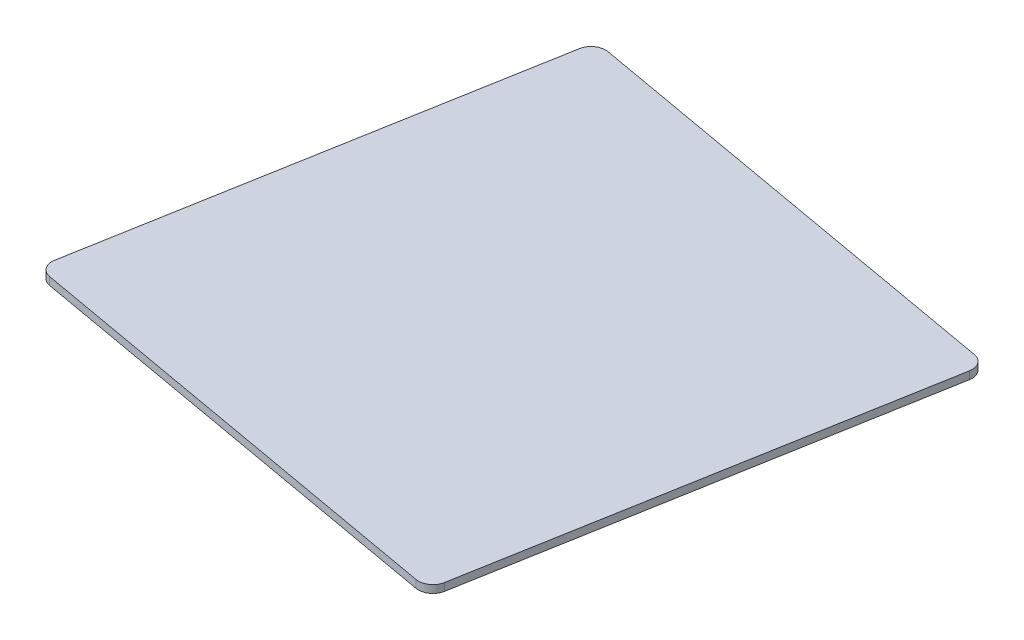
ISO-10303-21;
HEADER;
FILE_DESCRIPTION(('STEP AP214'),'2;1');
FILE_NAME('part.step','',(''),(''),'','','');
FILE_SCHEMA(('AUTOMOTIVE_DESIGN { 1 0 10303 214 1 1 1 1 }'));
ENDSEC;
DATA;
#1=APPLICATION_CONTEXT('core data for automotive mechanical design processes');
#2=APPLICATION_PROTOCOL_DEFINITION('international standard','automotive_design',2000,#1);
#3=PRODUCT_CONTEXT('',#1,'mechanical');
#4=PRODUCT('Part','Part','',(#3));
#5=PRODUCT_RELATED_PRODUCT_CATEGORY('part','',(#4));
#6=PRODUCT_DEFINITION_FORMATION('','',#4);
#7=PRODUCT_DEFINITION_CONTEXT('part definition',#1,'design');
#8=PRODUCT_DEFINITION('design','',#6,#7);
#9=PRODUCT_DEFINITION_SHAPE('','',#8);
#10=(LENGTH_UNIT() NAMED_UNIT(*) SI_UNIT(.MILLI.,.METRE.));
#11=(NAMED_UNIT(*) PLANE_ANGLE_UNIT() SI_UNIT($,.RADIAN.));
#12=(NAMED_UNIT(*) SI_UNIT($,.STERADIAN.) SOLID_ANGLE_UNIT());
#13=UNCERTAINTY_MEASURE_WITH_UNIT(LENGTH_MEASURE(1.E-05),#10,'distance_accuracy_value','');
#14=(GEOMETRIC_REPRESENTATION_CONTEXT(3) GLOBAL_UNCERTAINTY_ASSIGNED_CONTEXT((#13)) GLOBAL_UNIT_ASSIGNED_CONTEXT((#10,
#11,#12)) REPRESENTATION_CONTEXT('',''));
#15=CARTESIAN_POINT('',(0.,0.,0.));
#16=DIRECTION('',(0.,0.,1.));
#17=DIRECTION('',(1.,0.,0.));
#18=AXIS2_PLACEMENT_3D('',#15,#16,#17);
#19=CARTESIAN_POINT('',(-351.034472922423,-29.3713303337753,195.843976174293));
#20=DIRECTION('',(0.,1.,0.));
#21=DIRECTION('',(0.,0.,1.));
#22=AXIS2_PLACEMENT_3D('',#19,#20,#21);
#23=CYLINDRICAL_SURFACE('',#22,3.);
#24=CARTESIAN_POINT('',(-351.034472922423,-27.7713303337753,195.843976174293));
#25=DIRECTION('',(0.,-1.,0.));
#26=DIRECTION('',(0.,0.,-1.));
#27=AXIS2_PLACEMENT_3D('',#24,#25,#26);
#28=CIRCLE('',#27,3.);
#29=CARTESIAN_POINT('',(-353.98826081032,-27.7713303337753,195.319441034084));
#30=VERTEX_POINT('',#29);
#31=CARTESIAN_POINT('',(-350.509937782214,-27.7713303337753,192.890188286397));
#32=VERTEX_POINT('',#31);
#33=EDGE_CURVE('E139',#30,#32,#28,.T.);
#34=ORIENTED_EDGE('',*,*,#33,.T.);
#35=DIRECTION('',(0.,1.,0.));
#36=VECTOR('',#35,1.);
#37=CARTESIAN_POINT('',(-350.509937782214,-29.3713303337753,192.890188286397));
#38=LINE('',#37,#36);
#39=CARTESIAN_POINT('',(-350.509937782214,-29.3713303337753,192.890188286397));
#40=VERTEX_POINT('',#39);
#41=EDGE_CURVE('E11',#40,#32,#38,.T.);
#42=ORIENTED_EDGE('',*,*,#41,.F.);
#43=CARTESIAN_POINT('',(-351.034472922423,-29.3713303337753,195.843976174293));
#44=DIRECTION('',(0.,-1.,0.));
#45=DIRECTION('',(0.,0.,-1.));
#46=AXIS2_PLACEMENT_3D('',#43,#44,#45);
#47=CIRCLE('',#46,3.);
#48=CARTESIAN_POINT('',(-353.98826081032,-29.3713303337753,195.319441034084));
#49=VERTEX_POINT('',#48);
#50=EDGE_CURVE('E156',#49,#40,#47,.T.);
#51=ORIENTED_EDGE('',*,*,#50,.F.);
#52=DIRECTION('',(0.,1.,0.));
#53=VECTOR('',#52,1.);
#54=CARTESIAN_POINT('',(-353.98826081032,-29.3713303337753,195.319441034084));
#55=LINE('',#54,#53);
#56=EDGE_CURVE('E135',#49,#30,#55,.T.);
#57=ORIENTED_EDGE('',*,*,#56,.T.);
#58=EDGE_LOOP('',(#34,#42,#51,#57));
#59=FACE_BOUND('',#58,.T.);
#60=ADVANCED_FACE('F39',(#59),#23,.T.);
#61=CARTESIAN_POINT('',(-350.509937782214,-29.3713303337753,192.890188286397));
#62=DIRECTION('',(-0.174845046736448,0.,0.984595962632251));
#63=DIRECTION('',(0.984595962632251,0.,0.174845046736448));
#64=AXIS2_PLACEMENT_3D('',#61,#62,#63);
#65=PLANE('',#64);
#66=DIRECTION('',(0.984595962632251,0.,0.174845046736448));
#67=VECTOR('',#66,1.);
#68=CARTESIAN_POINT('',(-350.509937782214,-27.7713303337753,192.890188286397));
#69=LINE('',#68,#67);
#70=CARTESIAN_POINT('',(-257.957917294782,-27.7713303337753,209.325622679623));
#71=VERTEX_POINT('',#70);
#72=EDGE_CURVE('E142',#32,#71,#69,.T.);
#73=ORIENTED_EDGE('',*,*,#72,.T.);
#74=DIRECTION('',(0.,1.,0.));
#75=VECTOR('',#74,1.);
#76=CARTESIAN_POINT('',(-257.957917294782,-29.3713303337753,209.325622679623));
#77=LINE('',#76,#75);
#78=CARTESIAN_POINT('',(-257.957917294782,-29.3713303337753,209.325622679623));
#79=VERTEX_POINT('',#78);
#80=EDGE_CURVE('E47',#79,#71,#77,.T.);
#81=ORIENTED_EDGE('',*,*,#80,.F.);
#82=DIRECTION('',(0.984595962632251,0.,0.174845046736448));
#83=VECTOR('',#82,1.);
#84=CARTESIAN_POINT('',(-350.509937782214,-29.3713303337753,192.890188286397));
#85=LINE('',#84,#83);
#86=EDGE_CURVE('E100',#40,#79,#85,.T.);
#87=ORIENTED_EDGE('',*,*,#86,.F.);
#88=ORIENTED_EDGE('',*,*,#41,.T.);
#89=EDGE_LOOP('',(#73,#81,#87,#88));
#90=FACE_BOUND('',#89,.T.);
#91=ADVANCED_FACE('F196',(#90),#65,.F.);
#92=CARTESIAN_POINT('',(-258.482452434992,-29.3713303337753,212.27941056752));
#93=DIRECTION('',(0.,1.,0.));
#94=DIRECTION('',(0.,0.,1.));
#95=AXIS2_PLACEMENT_3D('',#92,#93,#94);
#96=CYLINDRICAL_SURFACE('',#95,3.);
#97=CARTESIAN_POINT('',(-258.482452434992,-27.7713303337753,212.27941056752));
#98=DIRECTION('',(0.,-1.,0.));
#99=DIRECTION('',(0.,0.,-1.));
#100=AXIS2_PLACEMENT_3D('',#97,#98,#99);
#101=CIRCLE('',#100,3.);
#102=CARTESIAN_POINT('',(-255.528664547095,-27.7713303337753,212.803945707729));
#103=VERTEX_POINT('',#102);
#104=EDGE_CURVE('E145',#71,#103,#101,.T.);
#105=ORIENTED_EDGE('',*,*,#104,.T.);
#106=DIRECTION('',(0.,1.,0.));
#107=VECTOR('',#106,1.);
#108=CARTESIAN_POINT('',(-255.528664547095,-29.3713303337753,212.803945707729));
#109=LINE('',#108,#107);
#110=CARTESIAN_POINT('',(-255.528664547095,-29.3713303337753,212.803945707729));
#111=VERTEX_POINT('',#110);
#112=EDGE_CURVE('E163',#111,#103,#109,.T.);
#113=ORIENTED_EDGE('',*,*,#112,.F.);
#114=CARTESIAN_POINT('',(-258.482452434992,-29.3713303337753,212.27941056752));
#115=DIRECTION('',(0.,-1.,0.));
#116=DIRECTION('',(0.,0.,-1.));
#117=AXIS2_PLACEMENT_3D('',#114,#115,#116);
#118=CIRCLE('',#117,3.);
#119=EDGE_CURVE('E174',#79,#111,#118,.T.);
#120=ORIENTED_EDGE('',*,*,#119,.F.);
#121=ORIENTED_EDGE('',*,*,#80,.T.);
#122=EDGE_LOOP('',(#105,#113,#120,#121));
#123=FACE_BOUND('',#122,.T.);
#124=ADVANCED_FACE('F172',(#123),#96,.T.);
#125=CARTESIAN_POINT('',(-255.528664547095,-29.3713303337753,212.803945707729));
#126=DIRECTION('',(-0.984595962632251,0.,-0.174845046736448));
#127=DIRECTION('',(-0.174845046736448,0.,0.984595962632251));
#128=AXIS2_PLACEMENT_3D('',#125,#126,#127);
#129=PLANE('',#128);
#130=DIRECTION('',(-0.174845046736448,0.,0.984595962632251));
#131=VECTOR('',#130,1.);
#132=CARTESIAN_POINT('',(-255.528664547095,-27.7713303337753,212.803945707729));
#133=LINE('',#132,#131);
#134=CARTESIAN_POINT('',(-271.964098940321,-27.7713303337753,305.355966195161));
#135=VERTEX_POINT('',#134);
#136=EDGE_CURVE('E148',#103,#135,#133,.T.);
#137=ORIENTED_EDGE('',*,*,#136,.T.);
#138=DIRECTION('',(0.,1.,0.));
#139=VECTOR('',#138,1.);
#140=CARTESIAN_POINT('',(-271.964098940321,-29.3713303337753,305.355966195161));
#141=LINE('',#140,#139);
#142=CARTESIAN_POINT('',(-271.964098940321,-29.3713303337753,305.355966195161));
#143=VERTEX_POINT('',#142);
#144=EDGE_CURVE('E160',#143,#135,#141,.T.);
#145=ORIENTED_EDGE('',*,*,#144,.F.);
#146=DIRECTION('',(-0.174845046736448,0.,0.984595962632251));
#147=VECTOR('',#146,1.);
#148=CARTESIAN_POINT('',(-255.528664547095,-29.3713303337753,212.803945707729));
#149=LINE('',#148,#147);
#150=EDGE_CURVE('E186',#111,#143,#149,.T.);
#151=ORIENTED_EDGE('',*,*,#150,.F.);
#152=ORIENTED_EDGE('',*,*,#112,.T.);
#153=EDGE_LOOP('',(#137,#145,#151,#152));
#154=FACE_BOUND('',#153,.T.);
#155=ADVANCED_FACE('F182',(#154),#129,.F.);
#156=CARTESIAN_POINT('',(-274.917886828218,-29.3713303337753,304.831431054951));
#157=DIRECTION('',(0.,1.,0.));
#158=DIRECTION('',(0.,0.,1.));
#159=AXIS2_PLACEMENT_3D('',#156,#157,#158);
#160=CYLINDRICAL_SURFACE('',#159,3.00000000000001);
#161=CARTESIAN_POINT('',(-274.917886828218,-27.7713303337753,304.831431054951));
#162=DIRECTION('',(0.,-1.,0.));
#163=DIRECTION('',(0.,0.,-1.));
#164=AXIS2_PLACEMENT_3D('',#161,#162,#163);
#165=CIRCLE('',#164,3.00000000000001);
#166=CARTESIAN_POINT('',(-275.442421968427,-27.7713303337753,307.785218942848));
#167=VERTEX_POINT('',#166);
#168=EDGE_CURVE('E151',#135,#167,#165,.T.);
#169=ORIENTED_EDGE('',*,*,#168,.T.);
#170=DIRECTION('',(0.,1.,0.));
#171=VECTOR('',#170,1.);
#172=CARTESIAN_POINT('',(-275.442421968427,-29.3713303337753,307.785218942848));
#173=LINE('',#172,#171);
#174=CARTESIAN_POINT('',(-275.442421968427,-29.3713303337753,307.785218942848));
#175=VERTEX_POINT('',#174);
#176=EDGE_CURVE('E130',#175,#167,#173,.T.);
#177=ORIENTED_EDGE('',*,*,#176,.F.);
#178=CARTESIAN_POINT('',(-274.917886828218,-29.3713303337753,304.831431054951));
#179=DIRECTION('',(0.,-1.,0.));
#180=DIRECTION('',(0.,0.,-1.));
#181=AXIS2_PLACEMENT_3D('',#178,#179,#180);
#182=CIRCLE('',#181,3.00000000000001);
#183=EDGE_CURVE('E121',#143,#175,#182,.T.);
#184=ORIENTED_EDGE('',*,*,#183,.F.);
#185=ORIENTED_EDGE('',*,*,#144,.T.);
#186=EDGE_LOOP('',(#169,#177,#184,#185));
#187=FACE_BOUND('',#186,.T.);
#188=ADVANCED_FACE('F185',(#187),#160,.T.);
#189=CARTESIAN_POINT('',(-275.442421968427,-29.3713303337753,307.785218942848));
#190=DIRECTION('',(0.174845046736448,0.,-0.984595962632251));
#191=DIRECTION('',(-0.984595962632251,0.,-0.174845046736448));
#192=AXIS2_PLACEMENT_3D('',#189,#190,#191);
#193=PLANE('',#192);
#194=DIRECTION('',(-0.984595962632251,0.,-0.174845046736448));
#195=VECTOR('',#194,1.);
#196=CARTESIAN_POINT('',(-275.442421968427,-27.7713303337753,307.785218942848));
#197=LINE('',#196,#195);
#198=CARTESIAN_POINT('',(-367.994442455859,-27.7713303337753,291.349784549622));
#199=VERTEX_POINT('',#198);
#200=EDGE_CURVE('E129',#167,#199,#197,.T.);
#201=ORIENTED_EDGE('',*,*,#200,.T.);
#202=DIRECTION('',(0.,1.,0.));
#203=VECTOR('',#202,1.);
#204=CARTESIAN_POINT('',(-367.994442455859,-29.3713303337753,291.349784549622));
#205=LINE('',#204,#203);
#206=CARTESIAN_POINT('',(-367.994442455859,-29.3713303337753,291.349784549622));
#207=VERTEX_POINT('',#206);
#208=EDGE_CURVE('E126',#207,#199,#205,.T.);
#209=ORIENTED_EDGE('',*,*,#208,.F.);
#210=DIRECTION('',(-0.984595962632251,0.,-0.174845046736448));
#211=VECTOR('',#210,1.);
#212=CARTESIAN_POINT('',(-275.442421968427,-29.3713303337753,307.785218942848));
#213=LINE('',#212,#211);
#214=EDGE_CURVE('E115',#175,#207,#213,.T.);
#215=ORIENTED_EDGE('',*,*,#214,.F.);
#216=ORIENTED_EDGE('',*,*,#176,.T.);
#217=EDGE_LOOP('',(#201,#209,#215,#216));
#218=FACE_BOUND('',#217,.T.);
#219=ADVANCED_FACE('F127',(#218),#193,.F.);
#220=CARTESIAN_POINT('',(-367.469907315649,-29.3713303337753,288.395996661725));
#221=DIRECTION('',(0.,1.,0.));
#222=DIRECTION('',(0.,0.,1.));
#223=AXIS2_PLACEMENT_3D('',#220,#221,#222);
#224=CYLINDRICAL_SURFACE('',#223,2.99999999999999);
#225=CARTESIAN_POINT('',(-367.469907315649,-27.7713303337753,288.395996661725));
#226=DIRECTION('',(0.,-1.,0.));
#227=DIRECTION('',(0.,0.,-1.));
#228=AXIS2_PLACEMENT_3D('',#225,#226,#227);
#229=CIRCLE('',#228,2.99999999999999);
#230=CARTESIAN_POINT('',(-370.423695203546,-27.7713303337753,287.871461521516));
#231=VERTEX_POINT('',#230);
#232=EDGE_CURVE('E86',#199,#231,#229,.T.);
#233=ORIENTED_EDGE('',*,*,#232,.T.);
#234=DIRECTION('',(0.,1.,0.));
#235=VECTOR('',#234,1.);
#236=CARTESIAN_POINT('',(-370.423695203546,-29.3713303337753,287.871461521516));
#237=LINE('',#236,#235);
#238=CARTESIAN_POINT('',(-370.423695203546,-29.3713303337753,287.871461521516));
#239=VERTEX_POINT('',#238);
#240=EDGE_CURVE('E131',#239,#231,#237,.T.);
#241=ORIENTED_EDGE('',*,*,#240,.F.);
#242=CARTESIAN_POINT('',(-367.469907315649,-29.3713303337753,288.395996661725));
#243=DIRECTION('',(0.,-1.,0.));
#244=DIRECTION('',(0.,0.,-1.));
#245=AXIS2_PLACEMENT_3D('',#242,#243,#244);
#246=CIRCLE('',#245,2.99999999999999);
#247=EDGE_CURVE('E119',#207,#239,#246,.T.);
#248=ORIENTED_EDGE('',*,*,#247,.F.);
#249=ORIENTED_EDGE('',*,*,#208,.T.);
#250=EDGE_LOOP('',(#233,#241,#248,#249));
#251=FACE_BOUND('',#250,.T.);
#252=ADVANCED_FACE('F133',(#251),#224,.T.);
#253=CARTESIAN_POINT('',(-370.423695203546,-29.3713303337753,287.871461521516));
#254=DIRECTION('',(0.984595962632251,0.,0.174845046736448));
#255=DIRECTION('',(0.174845046736448,0.,-0.984595962632251));
#256=AXIS2_PLACEMENT_3D('',#253,#254,#255);
#257=PLANE('',#256);
#258=DIRECTION('',(0.174845046736448,0.,-0.984595962632251));
#259=VECTOR('',#258,1.);
#260=CARTESIAN_POINT('',(-370.423695203546,-27.7713303337753,287.871461521516));
#261=LINE('',#260,#259);
#262=EDGE_CURVE('E92',#231,#30,#261,.T.);
#263=ORIENTED_EDGE('',*,*,#262,.T.);
#264=ORIENTED_EDGE('',*,*,#56,.F.);
#265=DIRECTION('',(0.174845046736448,0.,-0.984595962632251));
#266=VECTOR('',#265,1.);
#267=CARTESIAN_POINT('',(-370.423695203546,-29.3713303337753,287.871461521516));
#268=LINE('',#267,#266);
#269=EDGE_CURVE('E55',#239,#49,#268,.T.);
#270=ORIENTED_EDGE('',*,*,#269,.F.);
#271=ORIENTED_EDGE('',*,*,#240,.T.);
#272=EDGE_LOOP('',(#263,#264,#270,#271));
#273=FACE_BOUND('',#272,.T.);
#274=ADVANCED_FACE('F212',(#273),#257,.F.);
#275=CARTESIAN_POINT('',(-351.034472922423,-29.3713303337753,195.843976174293));
#276=DIRECTION('',(0.,-1.,0.));
#277=DIRECTION('',(0.,0.,-1.));
#278=AXIS2_PLACEMENT_3D('',#275,#276,#277);
#279=PLANE('',#278);
#280=ORIENTED_EDGE('',*,*,#50,.T.);
#281=ORIENTED_EDGE('',*,*,#86,.T.);
#282=ORIENTED_EDGE('',*,*,#119,.T.);
#283=ORIENTED_EDGE('',*,*,#150,.T.);
#284=ORIENTED_EDGE('',*,*,#183,.T.);
#285=ORIENTED_EDGE('',*,*,#214,.T.);
#286=ORIENTED_EDGE('',*,*,#247,.T.);
#287=ORIENTED_EDGE('',*,*,#269,.T.);
#288=EDGE_LOOP('',(#280,#281,#282,#283,#284,#285,#286,#287));
#289=FACE_BOUND('',#288,.T.);
#290=ADVANCED_FACE('F117',(#289),#279,.T.);
#291=CARTESIAN_POINT('',(-351.034472922423,-27.7713303337753,195.843976174293));
#292=DIRECTION('',(0.,-1.,0.));
#293=DIRECTION('',(0.,0.,-1.));
#294=AXIS2_PLACEMENT_3D('',#291,#292,#293);
#295=PLANE('',#294);
#296=ORIENTED_EDGE('',*,*,#33,.F.);
#297=ORIENTED_EDGE('',*,*,#262,.F.);
#298=ORIENTED_EDGE('',*,*,#232,.F.);
#299=ORIENTED_EDGE('',*,*,#200,.F.);
#300=ORIENTED_EDGE('',*,*,#168,.F.);
#301=ORIENTED_EDGE('',*,*,#136,.F.);
#302=ORIENTED_EDGE('',*,*,#104,.F.);
#303=ORIENTED_EDGE('',*,*,#72,.F.);
#304=EDGE_LOOP('',(#296,#297,#298,#299,#300,#301,#302,#303));
#305=FACE_BOUND('',#304,.T.);
#306=ADVANCED_FACE('F178',(#305),#295,.F.);
#307=CLOSED_SHELL('',(#60,#91,#124,#155,#188,#219,#252,#274,#290,#306));
#308=MANIFOLD_SOLID_BREP('B2',#307);
#309=ADVANCED_BREP_SHAPE_REPRESENTATION('',(#18,#308),#14);
#310=SHAPE_DEFINITION_REPRESENTATION(#9,#309);
ENDSEC;
END-ISO-10303-21;
